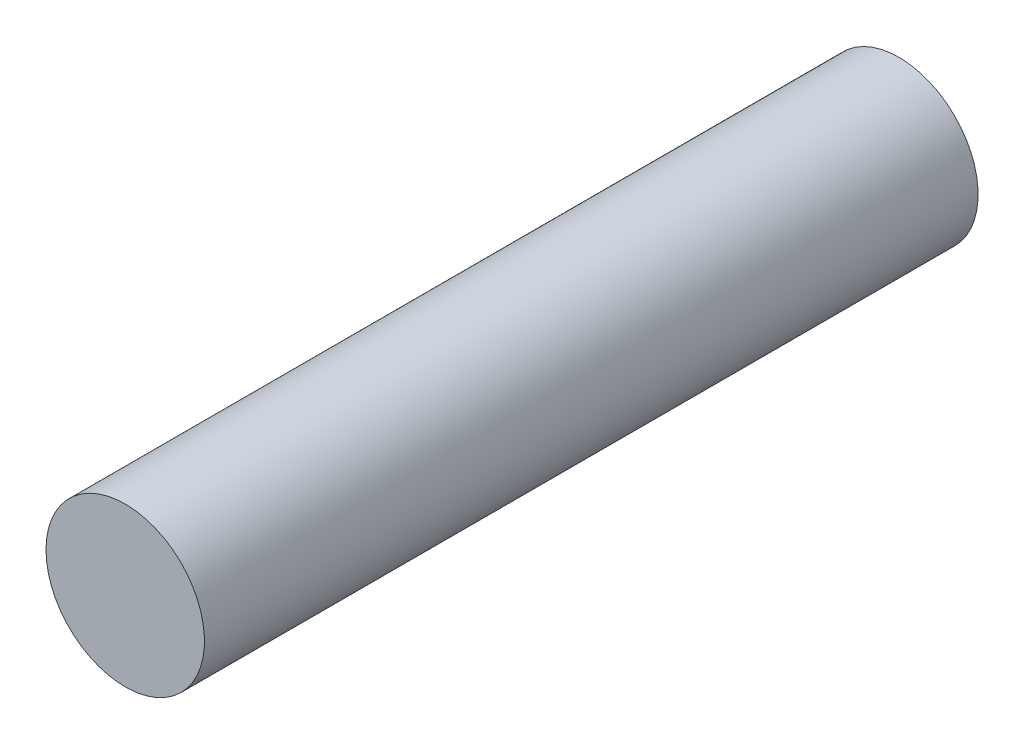
ISO-10303-21;
HEADER;
FILE_DESCRIPTION(('STEP AP214'),'2;1');
FILE_NAME('part.step','',(''),(''),'','','');
FILE_SCHEMA(('AUTOMOTIVE_DESIGN { 1 0 10303 214 1 1 1 1 }'));
ENDSEC;
DATA;
#1=APPLICATION_CONTEXT('core data for automotive mechanical design processes');
#2=APPLICATION_PROTOCOL_DEFINITION('international standard','automotive_design',2000,#1);
#3=PRODUCT_CONTEXT('',#1,'mechanical');
#4=PRODUCT('Part','Part','',(#3));
#5=PRODUCT_RELATED_PRODUCT_CATEGORY('part','',(#4));
#6=PRODUCT_DEFINITION_FORMATION('','',#4);
#7=PRODUCT_DEFINITION_CONTEXT('part definition',#1,'design');
#8=PRODUCT_DEFINITION('design','',#6,#7);
#9=PRODUCT_DEFINITION_SHAPE('','',#8);
#10=(LENGTH_UNIT() NAMED_UNIT(*) SI_UNIT(.MILLI.,.METRE.));
#11=(NAMED_UNIT(*) PLANE_ANGLE_UNIT() SI_UNIT($,.RADIAN.));
#12=(NAMED_UNIT(*) SI_UNIT($,.STERADIAN.) SOLID_ANGLE_UNIT());
#13=UNCERTAINTY_MEASURE_WITH_UNIT(LENGTH_MEASURE(1.E-05),#10,'distance_accuracy_value','');
#14=(GEOMETRIC_REPRESENTATION_CONTEXT(3) GLOBAL_UNCERTAINTY_ASSIGNED_CONTEXT((#13)) GLOBAL_UNIT_ASSIGNED_CONTEXT((#10,
#11,#12)) REPRESENTATION_CONTEXT('',''));
#15=CARTESIAN_POINT('',(0.,0.,0.));
#16=DIRECTION('',(0.,0.,1.));
#17=DIRECTION('',(1.,0.,0.));
#18=AXIS2_PLACEMENT_3D('',#15,#16,#17);
#19=CARTESIAN_POINT('',(0.215,0.,0.));
#20=DIRECTION('',(0.,0.,-1.));
#21=DIRECTION('',(-1.,0.,0.));
#22=AXIS2_PLACEMENT_3D('',#19,#20,#21);
#23=PLANE('',#22);
#24=CARTESIAN_POINT('',(0.,0.,0.));
#25=DIRECTION('',(0.,0.,-1.));
#26=DIRECTION('',(-1.,0.,0.));
#27=AXIS2_PLACEMENT_3D('',#24,#25,#26);
#28=CIRCLE('',#27,0.215);
#29=CARTESIAN_POINT('',(-0.215,0.,0.));
#30=VERTEX_POINT('',#29);
#31=EDGE_CURVE('E18',#30,#30,#28,.F.);
#32=ORIENTED_EDGE('',*,*,#31,.F.);
#33=EDGE_LOOP('',(#32));
#34=FACE_BOUND('',#33,.T.);
#35=ADVANCED_FACE('F15',(#34),#23,.T.);
#36=CARTESIAN_POINT('',(0.215,0.,2.1));
#37=DIRECTION('',(0.,0.,-1.));
#38=DIRECTION('',(-1.,0.,0.));
#39=AXIS2_PLACEMENT_3D('',#36,#37,#38);
#40=PLANE('',#39);
#41=CARTESIAN_POINT('',(0.,0.,2.1));
#42=DIRECTION('',(0.,0.,-1.));
#43=DIRECTION('',(-1.,0.,0.));
#44=AXIS2_PLACEMENT_3D('',#41,#42,#43);
#45=CIRCLE('',#44,0.215);
#46=CARTESIAN_POINT('',(-0.215,0.,2.1));
#47=VERTEX_POINT('',#46);
#48=EDGE_CURVE('E10',#47,#47,#45,.T.);
#49=ORIENTED_EDGE('',*,*,#48,.F.);
#50=EDGE_LOOP('',(#49));
#51=FACE_BOUND('',#50,.T.);
#52=ADVANCED_FACE('F30',(#51),#40,.F.);
#53=CARTESIAN_POINT('',(0.,0.,0.));
#54=DIRECTION('',(0.,0.,-1.));
#55=DIRECTION('',(-1.,0.,0.));
#56=AXIS2_PLACEMENT_3D('',#53,#54,#55);
#57=CYLINDRICAL_SURFACE('',#56,0.215);
#58=ORIENTED_EDGE('',*,*,#31,.T.);
#59=EDGE_LOOP('',(#58));
#60=FACE_BOUND('',#59,.T.);
#61=ORIENTED_EDGE('',*,*,#48,.T.);
#62=EDGE_LOOP('',(#61));
#63=FACE_BOUND('',#62,.T.);
#64=ADVANCED_FACE('F27',(#60,#63),#57,.T.);
#65=CLOSED_SHELL('',(#35,#52,#64));
#66=MANIFOLD_SOLID_BREP('B1',#65);
#67=ADVANCED_BREP_SHAPE_REPRESENTATION('',(#18,#66),#14);
#68=SHAPE_DEFINITION_REPRESENTATION(#9,#67);
ENDSEC;
END-ISO-10303-21;
